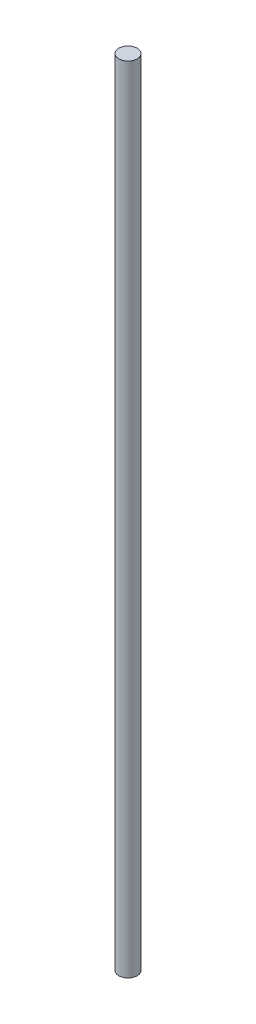
ISO-10303-21;
HEADER;
FILE_DESCRIPTION(('STEP AP214'),'2;1');
FILE_NAME('part.step','',(''),(''),'','','');
FILE_SCHEMA(('AUTOMOTIVE_DESIGN { 1 0 10303 214 1 1 1 1 }'));
ENDSEC;
DATA;
#1=APPLICATION_CONTEXT('core data for automotive mechanical design processes');
#2=APPLICATION_PROTOCOL_DEFINITION('international standard','automotive_design',2000,#1);
#3=PRODUCT_CONTEXT('',#1,'mechanical');
#4=PRODUCT('Part','Part','',(#3));
#5=PRODUCT_RELATED_PRODUCT_CATEGORY('part','',(#4));
#6=PRODUCT_DEFINITION_FORMATION('','',#4);
#7=PRODUCT_DEFINITION_CONTEXT('part definition',#1,'design');
#8=PRODUCT_DEFINITION('design','',#6,#7);
#9=PRODUCT_DEFINITION_SHAPE('','',#8);
#10=(LENGTH_UNIT() NAMED_UNIT(*) SI_UNIT(.MILLI.,.METRE.));
#11=(NAMED_UNIT(*) PLANE_ANGLE_UNIT() SI_UNIT($,.RADIAN.));
#12=(NAMED_UNIT(*) SI_UNIT($,.STERADIAN.) SOLID_ANGLE_UNIT());
#13=UNCERTAINTY_MEASURE_WITH_UNIT(LENGTH_MEASURE(1.E-05),#10,'distance_accuracy_value','');
#14=(GEOMETRIC_REPRESENTATION_CONTEXT(3) GLOBAL_UNCERTAINTY_ASSIGNED_CONTEXT((#13)) GLOBAL_UNIT_ASSIGNED_CONTEXT((#10,
#11,#12)) REPRESENTATION_CONTEXT('',''));
#15=CARTESIAN_POINT('',(0.,0.,0.));
#16=DIRECTION('',(0.,0.,1.));
#17=DIRECTION('',(1.,0.,0.));
#18=AXIS2_PLACEMENT_3D('',#15,#16,#17);
#19=CARTESIAN_POINT('',(-10.6771421535329,345.,0.935003973896952));
#20=DIRECTION('',(0.,-1.,0.));
#21=DIRECTION('',(0.,0.,-1.));
#22=AXIS2_PLACEMENT_3D('',#19,#20,#21);
#23=CYLINDRICAL_SURFACE('',#22,4.);
#24=CARTESIAN_POINT('',(-10.6771421535329,345.,0.935003973896952));
#25=DIRECTION('',(0.,1.,0.));
#26=DIRECTION('',(0.,0.,1.));
#27=AXIS2_PLACEMENT_3D('',#24,#25,#26);
#28=CIRCLE('',#27,4.);
#29=CARTESIAN_POINT('',(-10.6771421535329,345.,4.93500397389695));
#30=VERTEX_POINT('',#29);
#31=EDGE_CURVE('E10',#30,#30,#28,.T.);
#32=ORIENTED_EDGE('',*,*,#31,.F.);
#33=EDGE_LOOP('',(#32));
#34=FACE_BOUND('',#33,.T.);
#35=CARTESIAN_POINT('',(-10.6771421535329,0.,0.935003973896952));
#36=DIRECTION('',(0.,1.,0.));
#37=DIRECTION('',(0.,0.,1.));
#38=AXIS2_PLACEMENT_3D('',#35,#36,#37);
#39=CIRCLE('',#38,4.);
#40=CARTESIAN_POINT('',(-10.6771421535329,0.,4.93500397389695));
#41=VERTEX_POINT('',#40);
#42=EDGE_CURVE('E35',#41,#41,#39,.T.);
#43=ORIENTED_EDGE('',*,*,#42,.T.);
#44=EDGE_LOOP('',(#43));
#45=FACE_BOUND('',#44,.T.);
#46=ADVANCED_FACE('F32',(#34,#45),#23,.T.);
#47=CARTESIAN_POINT('',(-10.6771421535329,345.,0.935003973896952));
#48=DIRECTION('',(0.,1.,0.));
#49=DIRECTION('',(0.,0.,1.));
#50=AXIS2_PLACEMENT_3D('',#47,#48,#49);
#51=PLANE('',#50);
#52=ORIENTED_EDGE('',*,*,#31,.T.);
#53=EDGE_LOOP('',(#52));
#54=FACE_BOUND('',#53,.T.);
#55=ADVANCED_FACE('F47',(#54),#51,.T.);
#56=CARTESIAN_POINT('',(-10.6771421535329,0.,0.935003973896952));
#57=DIRECTION('',(0.,1.,0.));
#58=DIRECTION('',(0.,0.,1.));
#59=AXIS2_PLACEMENT_3D('',#56,#57,#58);
#60=PLANE('',#59);
#61=ORIENTED_EDGE('',*,*,#42,.F.);
#62=EDGE_LOOP('',(#61));
#63=FACE_BOUND('',#62,.T.);
#64=ADVANCED_FACE('F45',(#63),#60,.F.);
#65=CLOSED_SHELL('',(#46,#55,#64));
#66=MANIFOLD_SOLID_BREP('B2',#65);
#67=ADVANCED_BREP_SHAPE_REPRESENTATION('',(#18,#66),#14);
#68=SHAPE_DEFINITION_REPRESENTATION(#9,#67);
ENDSEC;
END-ISO-10303-21;
